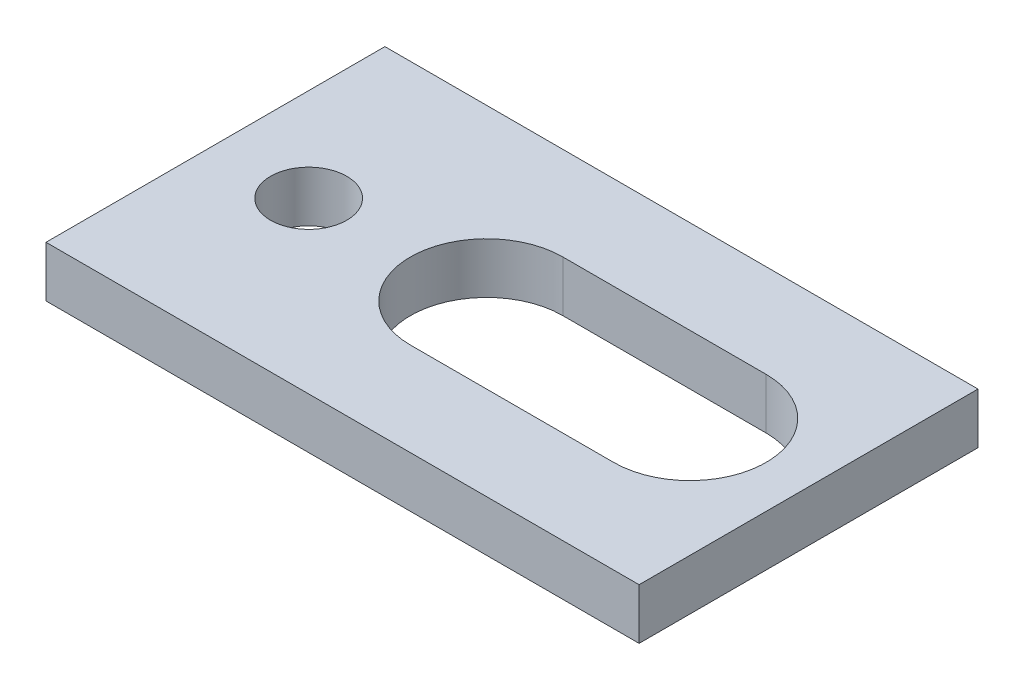
ISO-10303-21;
HEADER;
FILE_DESCRIPTION(('STEP AP214'),'2;1');
FILE_NAME('part.step','',(''),(''),'','','');
FILE_SCHEMA(('AUTOMOTIVE_DESIGN { 1 0 10303 214 1 1 1 1 }'));
ENDSEC;
DATA;
#1=APPLICATION_CONTEXT('core data for automotive mechanical design processes');
#2=APPLICATION_PROTOCOL_DEFINITION('international standard','automotive_design',2000,#1);
#3=PRODUCT_CONTEXT('',#1,'mechanical');
#4=PRODUCT('Part','Part','',(#3));
#5=PRODUCT_RELATED_PRODUCT_CATEGORY('part','',(#4));
#6=PRODUCT_DEFINITION_FORMATION('','',#4);
#7=PRODUCT_DEFINITION_CONTEXT('part definition',#1,'design');
#8=PRODUCT_DEFINITION('design','',#6,#7);
#9=PRODUCT_DEFINITION_SHAPE('','',#8);
#10=(LENGTH_UNIT() NAMED_UNIT(*) SI_UNIT(.MILLI.,.METRE.));
#11=(NAMED_UNIT(*) PLANE_ANGLE_UNIT() SI_UNIT($,.RADIAN.));
#12=(NAMED_UNIT(*) SI_UNIT($,.STERADIAN.) SOLID_ANGLE_UNIT());
#13=UNCERTAINTY_MEASURE_WITH_UNIT(LENGTH_MEASURE(1.E-05),#10,'distance_accuracy_value','');
#14=(GEOMETRIC_REPRESENTATION_CONTEXT(3) GLOBAL_UNCERTAINTY_ASSIGNED_CONTEXT((#13)) GLOBAL_UNIT_ASSIGNED_CONTEXT((#10,
#11,#12)) REPRESENTATION_CONTEXT('',''));
#15=CARTESIAN_POINT('',(0.,0.,0.));
#16=DIRECTION('',(0.,0.,1.));
#17=DIRECTION('',(1.,0.,0.));
#18=AXIS2_PLACEMENT_3D('',#15,#16,#17);
#19=CARTESIAN_POINT('',(-24.9597315436242,3.,-4.13590604026846));
#20=DIRECTION('',(1.,0.,0.));
#21=DIRECTION('',(0.,0.,-1.));
#22=AXIS2_PLACEMENT_3D('',#19,#20,#21);
#23=PLANE('',#22);
#24=DIRECTION('',(0.,0.,1.));
#25=VECTOR('',#24,1.);
#26=CARTESIAN_POINT('',(-24.9597315436242,0.,-4.13590604026846));
#27=LINE('',#26,#25);
#28=CARTESIAN_POINT('',(-24.9597315436242,0.,-4.13590604026846));
#29=VERTEX_POINT('',#28);
#30=CARTESIAN_POINT('',(-24.9597315436242,0.,15.8640939597315));
#31=VERTEX_POINT('',#30);
#32=EDGE_CURVE('E203',#29,#31,#27,.T.);
#33=ORIENTED_EDGE('',*,*,#32,.T.);
#34=DIRECTION('',(0.,-1.,0.));
#35=VECTOR('',#34,1.);
#36=CARTESIAN_POINT('',(-24.9597315436242,3.,15.8640939597315));
#37=LINE('',#36,#35);
#38=CARTESIAN_POINT('',(-24.9597315436242,3.,15.8640939597315));
#39=VERTEX_POINT('',#38);
#40=EDGE_CURVE('E13',#39,#31,#37,.T.);
#41=ORIENTED_EDGE('',*,*,#40,.F.);
#42=DIRECTION('',(0.,0.,1.));
#43=VECTOR('',#42,1.);
#44=CARTESIAN_POINT('',(-24.9597315436242,3.,-4.13590604026846));
#45=LINE('',#44,#43);
#46=CARTESIAN_POINT('',(-24.9597315436242,3.,-4.13590604026846));
#47=VERTEX_POINT('',#46);
#48=EDGE_CURVE('E204',#47,#39,#45,.T.);
#49=ORIENTED_EDGE('',*,*,#48,.F.);
#50=DIRECTION('',(0.,-1.,0.));
#51=VECTOR('',#50,1.);
#52=CARTESIAN_POINT('',(-24.9597315436242,3.,-4.13590604026846));
#53=LINE('',#52,#51);
#54=EDGE_CURVE('E214',#47,#29,#53,.T.);
#55=ORIENTED_EDGE('',*,*,#54,.T.);
#56=EDGE_LOOP('',(#33,#41,#49,#55));
#57=FACE_BOUND('',#56,.T.);
#58=ADVANCED_FACE('F107',(#57),#23,.F.);
#59=CARTESIAN_POINT('',(-24.9597315436242,3.,15.8640939597315));
#60=DIRECTION('',(0.,0.,-1.));
#61=DIRECTION('',(-1.,0.,0.));
#62=AXIS2_PLACEMENT_3D('',#59,#60,#61);
#63=PLANE('',#62);
#64=DIRECTION('',(1.,0.,0.));
#65=VECTOR('',#64,1.);
#66=CARTESIAN_POINT('',(-24.9597315436242,0.,15.8640939597315));
#67=LINE('',#66,#65);
#68=CARTESIAN_POINT('',(10.0402684563758,0.,15.8640939597315));
#69=VERTEX_POINT('',#68);
#70=EDGE_CURVE('E217',#31,#69,#67,.T.);
#71=ORIENTED_EDGE('',*,*,#70,.T.);
#72=DIRECTION('',(0.,-1.,0.));
#73=VECTOR('',#72,1.);
#74=CARTESIAN_POINT('',(10.0402684563758,3.,15.8640939597315));
#75=LINE('',#74,#73);
#76=CARTESIAN_POINT('',(10.0402684563758,3.,15.8640939597315));
#77=VERTEX_POINT('',#76);
#78=EDGE_CURVE('E114',#77,#69,#75,.T.);
#79=ORIENTED_EDGE('',*,*,#78,.F.);
#80=DIRECTION('',(1.,0.,0.));
#81=VECTOR('',#80,1.);
#82=CARTESIAN_POINT('',(-24.9597315436242,3.,15.8640939597315));
#83=LINE('',#82,#81);
#84=EDGE_CURVE('E207',#39,#77,#83,.T.);
#85=ORIENTED_EDGE('',*,*,#84,.F.);
#86=ORIENTED_EDGE('',*,*,#40,.T.);
#87=EDGE_LOOP('',(#71,#79,#85,#86));
#88=FACE_BOUND('',#87,.T.);
#89=ADVANCED_FACE('F245',(#88),#63,.F.);
#90=CARTESIAN_POINT('',(10.0402684563758,3.,-4.13590604026846));
#91=DIRECTION('',(-1.,0.,0.));
#92=DIRECTION('',(0.,0.,1.));
#93=AXIS2_PLACEMENT_3D('',#90,#91,#92);
#94=PLANE('',#93);
#95=DIRECTION('',(0.,0.,-1.));
#96=VECTOR('',#95,1.);
#97=CARTESIAN_POINT('',(10.0402684563758,0.,-4.13590604026846));
#98=LINE('',#97,#96);
#99=CARTESIAN_POINT('',(10.0402684563758,0.,-4.13590604026846));
#100=VERTEX_POINT('',#99);
#101=EDGE_CURVE('E219',#69,#100,#98,.T.);
#102=ORIENTED_EDGE('',*,*,#101,.T.);
#103=DIRECTION('',(0.,-1.,0.));
#104=VECTOR('',#103,1.);
#105=CARTESIAN_POINT('',(10.0402684563758,3.,-4.13590604026846));
#106=LINE('',#105,#104);
#107=CARTESIAN_POINT('',(10.0402684563758,3.,-4.13590604026846));
#108=VERTEX_POINT('',#107);
#109=EDGE_CURVE('E224',#108,#100,#106,.T.);
#110=ORIENTED_EDGE('',*,*,#109,.F.);
#111=DIRECTION('',(0.,0.,-1.));
#112=VECTOR('',#111,1.);
#113=CARTESIAN_POINT('',(10.0402684563758,3.,-4.13590604026846));
#114=LINE('',#113,#112);
#115=EDGE_CURVE('E210',#77,#108,#114,.T.);
#116=ORIENTED_EDGE('',*,*,#115,.F.);
#117=ORIENTED_EDGE('',*,*,#78,.T.);
#118=EDGE_LOOP('',(#102,#110,#116,#117));
#119=FACE_BOUND('',#118,.T.);
#120=ADVANCED_FACE('F231',(#119),#94,.F.);
#121=CARTESIAN_POINT('',(-24.9597315436242,3.,-4.13590604026846));
#122=DIRECTION('',(0.,0.,1.));
#123=DIRECTION('',(1.,0.,0.));
#124=AXIS2_PLACEMENT_3D('',#121,#122,#123);
#125=PLANE('',#124);
#126=DIRECTION('',(-1.,0.,0.));
#127=VECTOR('',#126,1.);
#128=CARTESIAN_POINT('',(-24.9597315436242,0.,-4.13590604026846));
#129=LINE('',#128,#127);
#130=EDGE_CURVE('E208',#100,#29,#129,.T.);
#131=ORIENTED_EDGE('',*,*,#130,.T.);
#132=ORIENTED_EDGE('',*,*,#54,.F.);
#133=DIRECTION('',(-1.,0.,0.));
#134=VECTOR('',#133,1.);
#135=CARTESIAN_POINT('',(-24.9597315436242,3.,-4.13590604026846));
#136=LINE('',#135,#134);
#137=EDGE_CURVE('E212',#108,#47,#136,.T.);
#138=ORIENTED_EDGE('',*,*,#137,.F.);
#139=ORIENTED_EDGE('',*,*,#109,.T.);
#140=EDGE_LOOP('',(#131,#132,#138,#139));
#141=FACE_BOUND('',#140,.T.);
#142=ADVANCED_FACE('F238',(#141),#125,.F.);
#143=CARTESIAN_POINT('',(0.,3.,0.));
#144=DIRECTION('',(0.,1.,0.));
#145=DIRECTION('',(0.,0.,1.));
#146=AXIS2_PLACEMENT_3D('',#143,#144,#145);
#147=PLANE('',#146);
#148=CARTESIAN_POINT('',(-19.4597315436242,3.,5.86409395973154));
#149=DIRECTION('',(0.,1.,0.));
#150=DIRECTION('',(0.,0.,1.));
#151=AXIS2_PLACEMENT_3D('',#148,#149,#150);
#152=CIRCLE('',#151,2.25);
#153=CARTESIAN_POINT('',(-19.4597315436242,3.,8.11409395973154));
#154=VERTEX_POINT('',#153);
#155=EDGE_CURVE('E284',#154,#154,#152,.T.);
#156=ORIENTED_EDGE('',*,*,#155,.F.);
#157=EDGE_LOOP('',(#156));
#158=FACE_BOUND('',#157,.T.);
#159=DIRECTION('',(1.,0.,0.));
#160=VECTOR('',#159,1.);
#161=CARTESIAN_POINT('',(-8.95973154362416,3.,10.3640939597316));
#162=LINE('',#161,#160);
#163=CARTESIAN_POINT('',(-8.95973154362416,3.,10.3640939597315));
#164=VERTEX_POINT('',#163);
#165=CARTESIAN_POINT('',(3.04026845637584,3.,10.3640939597316));
#166=VERTEX_POINT('',#165);
#167=EDGE_CURVE('E179',#164,#166,#162,.T.);
#168=ORIENTED_EDGE('',*,*,#167,.F.);
#169=CARTESIAN_POINT('',(-8.95973154362416,3.,5.86409395973154));
#170=DIRECTION('',(0.,1.,0.));
#171=DIRECTION('',(0.,0.,1.));
#172=AXIS2_PLACEMENT_3D('',#169,#170,#171);
#173=CIRCLE('',#172,4.5);
#174=CARTESIAN_POINT('',(-8.95973154362416,3.,1.36409395973154));
#175=VERTEX_POINT('',#174);
#176=EDGE_CURVE('E183',#175,#164,#173,.T.);
#177=ORIENTED_EDGE('',*,*,#176,.F.);
#178=DIRECTION('',(1.,0.,0.));
#179=VECTOR('',#178,1.);
#180=CARTESIAN_POINT('',(-8.95973154362416,3.,1.36409395973154));
#181=LINE('',#180,#179);
#182=CARTESIAN_POINT('',(3.04026845637584,3.,1.36409395973154));
#183=VERTEX_POINT('',#182);
#184=EDGE_CURVE('E190',#175,#183,#181,.T.);
#185=ORIENTED_EDGE('',*,*,#184,.T.);
#186=CARTESIAN_POINT('',(3.04026845637584,3.,5.86409395973154));
#187=DIRECTION('',(0.,1.,0.));
#188=DIRECTION('',(0.,0.,1.));
#189=AXIS2_PLACEMENT_3D('',#186,#187,#188);
#190=CIRCLE('',#189,4.5);
#191=EDGE_CURVE('E195',#166,#183,#190,.T.);
#192=ORIENTED_EDGE('',*,*,#191,.F.);
#193=EDGE_LOOP('',(#168,#177,#185,#192));
#194=FACE_BOUND('',#193,.T.);
#195=ORIENTED_EDGE('',*,*,#48,.T.);
#196=ORIENTED_EDGE('',*,*,#84,.T.);
#197=ORIENTED_EDGE('',*,*,#115,.T.);
#198=ORIENTED_EDGE('',*,*,#137,.T.);
#199=EDGE_LOOP('',(#195,#196,#197,#198));
#200=FACE_BOUND('',#199,.T.);
#201=ADVANCED_FACE('F244',(#158,#194,#200),#147,.T.);
#202=CARTESIAN_POINT('',(0.,0.,0.));
#203=DIRECTION('',(0.,1.,0.));
#204=DIRECTION('',(0.,0.,1.));
#205=AXIS2_PLACEMENT_3D('',#202,#203,#204);
#206=PLANE('',#205);
#207=CARTESIAN_POINT('',(-19.4597315436242,0.,5.86409395973154));
#208=DIRECTION('',(0.,1.,0.));
#209=DIRECTION('',(0.,0.,1.));
#210=AXIS2_PLACEMENT_3D('',#207,#208,#209);
#211=CIRCLE('',#210,2.25);
#212=CARTESIAN_POINT('',(-19.4597315436242,0.,8.11409395973154));
#213=VERTEX_POINT('',#212);
#214=EDGE_CURVE('E281',#213,#213,#211,.T.);
#215=ORIENTED_EDGE('',*,*,#214,.T.);
#216=EDGE_LOOP('',(#215));
#217=FACE_BOUND('',#216,.T.);
#218=DIRECTION('',(1.,0.,0.));
#219=VECTOR('',#218,1.);
#220=CARTESIAN_POINT('',(-8.95973154362416,0.,10.3640939597315));
#221=LINE('',#220,#219);
#222=CARTESIAN_POINT('',(-8.95973154362416,0.,10.3640939597315));
#223=VERTEX_POINT('',#222);
#224=CARTESIAN_POINT('',(3.04026845637584,0.,10.3640939597315));
#225=VERTEX_POINT('',#224);
#226=EDGE_CURVE('E171',#223,#225,#221,.T.);
#227=ORIENTED_EDGE('',*,*,#226,.T.);
#228=CARTESIAN_POINT('',(3.04026845637584,0.,5.86409395973154));
#229=DIRECTION('',(0.,1.,0.));
#230=DIRECTION('',(0.,0.,1.));
#231=AXIS2_PLACEMENT_3D('',#228,#229,#230);
#232=CIRCLE('',#231,4.5);
#233=CARTESIAN_POINT('',(3.04026845637584,0.,1.36409395973154));
#234=VERTEX_POINT('',#233);
#235=EDGE_CURVE('E198',#225,#234,#232,.T.);
#236=ORIENTED_EDGE('',*,*,#235,.T.);
#237=DIRECTION('',(1.,0.,0.));
#238=VECTOR('',#237,1.);
#239=CARTESIAN_POINT('',(-8.95973154362416,0.,1.36409395973154));
#240=LINE('',#239,#238);
#241=CARTESIAN_POINT('',(-8.95973154362416,0.,1.36409395973154));
#242=VERTEX_POINT('',#241);
#243=EDGE_CURVE('E178',#242,#234,#240,.T.);
#244=ORIENTED_EDGE('',*,*,#243,.F.);
#245=CARTESIAN_POINT('',(-8.95973154362416,0.,5.86409395973154));
#246=DIRECTION('',(0.,1.,0.));
#247=DIRECTION('',(0.,0.,1.));
#248=AXIS2_PLACEMENT_3D('',#245,#246,#247);
#249=CIRCLE('',#248,4.5);
#250=EDGE_CURVE('E126',#242,#223,#249,.T.);
#251=ORIENTED_EDGE('',*,*,#250,.T.);
#252=EDGE_LOOP('',(#227,#236,#244,#251));
#253=FACE_BOUND('',#252,.T.);
#254=ORIENTED_EDGE('',*,*,#32,.F.);
#255=ORIENTED_EDGE('',*,*,#130,.F.);
#256=ORIENTED_EDGE('',*,*,#101,.F.);
#257=ORIENTED_EDGE('',*,*,#70,.F.);
#258=EDGE_LOOP('',(#254,#255,#256,#257));
#259=FACE_BOUND('',#258,.T.);
#260=ADVANCED_FACE('F187',(#217,#253,#259),#206,.F.);
#261=CARTESIAN_POINT('',(3.04026845637584,3.,5.86409395973154));
#262=DIRECTION('',(0.,1.,0.));
#263=DIRECTION('',(0.,0.,1.));
#264=AXIS2_PLACEMENT_3D('',#261,#262,#263);
#265=CYLINDRICAL_SURFACE('',#264,4.5);
#266=ORIENTED_EDGE('',*,*,#235,.F.);
#267=DIRECTION('',(0.,1.,0.));
#268=VECTOR('',#267,1.);
#269=CARTESIAN_POINT('',(3.04026845637584,3.,10.3640939597315));
#270=LINE('',#269,#268);
#271=EDGE_CURVE('E175',#166,#225,#270,.F.);
#272=ORIENTED_EDGE('',*,*,#271,.F.);
#273=ORIENTED_EDGE('',*,*,#191,.T.);
#274=DIRECTION('',(0.,1.,0.));
#275=VECTOR('',#274,1.);
#276=CARTESIAN_POINT('',(3.04026845637584,3.,1.36409395973154));
#277=LINE('',#276,#275);
#278=EDGE_CURVE('E200',#234,#183,#277,.T.);
#279=ORIENTED_EDGE('',*,*,#278,.F.);
#280=EDGE_LOOP('',(#266,#272,#273,#279));
#281=FACE_BOUND('',#280,.T.);
#282=ADVANCED_FACE('F257',(#281),#265,.F.);
#283=CARTESIAN_POINT('',(-8.95973154362416,3.,5.86409395973154));
#284=DIRECTION('',(0.,1.,0.));
#285=DIRECTION('',(0.,0.,1.));
#286=AXIS2_PLACEMENT_3D('',#283,#284,#285);
#287=CYLINDRICAL_SURFACE('',#286,4.5);
#288=ORIENTED_EDGE('',*,*,#176,.T.);
#289=DIRECTION('',(0.,1.,0.));
#290=VECTOR('',#289,1.);
#291=CARTESIAN_POINT('',(-8.95973154362416,3.,10.3640939597315));
#292=LINE('',#291,#290);
#293=EDGE_CURVE('E173',#223,#164,#292,.T.);
#294=ORIENTED_EDGE('',*,*,#293,.F.);
#295=ORIENTED_EDGE('',*,*,#250,.F.);
#296=DIRECTION('',(0.,1.,0.));
#297=VECTOR('',#296,1.);
#298=CARTESIAN_POINT('',(-8.95973154362416,3.,1.36409395973154));
#299=LINE('',#298,#297);
#300=EDGE_CURVE('E121',#175,#242,#299,.F.);
#301=ORIENTED_EDGE('',*,*,#300,.F.);
#302=EDGE_LOOP('',(#288,#294,#295,#301));
#303=FACE_BOUND('',#302,.T.);
#304=ADVANCED_FACE('F181',(#303),#287,.F.);
#305=CARTESIAN_POINT('',(-8.95973154362416,3.,1.36409395973154));
#306=DIRECTION('',(0.,0.,-1.));
#307=DIRECTION('',(-1.,0.,0.));
#308=AXIS2_PLACEMENT_3D('',#305,#306,#307);
#309=PLANE('',#308);
#310=ORIENTED_EDGE('',*,*,#278,.T.);
#311=ORIENTED_EDGE('',*,*,#184,.F.);
#312=ORIENTED_EDGE('',*,*,#300,.T.);
#313=ORIENTED_EDGE('',*,*,#243,.T.);
#314=EDGE_LOOP('',(#310,#311,#312,#313));
#315=FACE_BOUND('',#314,.T.);
#316=ADVANCED_FACE('F267',(#315),#309,.F.);
#317=CARTESIAN_POINT('',(-8.95973154362416,3.,10.3640939597315));
#318=DIRECTION('',(0.,0.,1.));
#319=DIRECTION('',(1.,0.,0.));
#320=AXIS2_PLACEMENT_3D('',#317,#318,#319);
#321=PLANE('',#320);
#322=ORIENTED_EDGE('',*,*,#271,.T.);
#323=ORIENTED_EDGE('',*,*,#226,.F.);
#324=ORIENTED_EDGE('',*,*,#293,.T.);
#325=ORIENTED_EDGE('',*,*,#167,.T.);
#326=EDGE_LOOP('',(#322,#323,#324,#325));
#327=FACE_BOUND('',#326,.T.);
#328=ADVANCED_FACE('F172',(#327),#321,.F.);
#329=CARTESIAN_POINT('',(-19.4597315436242,3.,5.86409395973154));
#330=DIRECTION('',(0.,1.,0.));
#331=DIRECTION('',(0.,0.,1.));
#332=AXIS2_PLACEMENT_3D('',#329,#330,#331);
#333=CYLINDRICAL_SURFACE('',#332,2.25);
#334=ORIENTED_EDGE('',*,*,#214,.F.);
#335=EDGE_LOOP('',(#334));
#336=FACE_BOUND('',#335,.T.);
#337=ORIENTED_EDGE('',*,*,#155,.T.);
#338=EDGE_LOOP('',(#337));
#339=FACE_BOUND('',#338,.T.);
#340=ADVANCED_FACE('F273',(#336,#339),#333,.F.);
#341=CLOSED_SHELL('',(#58,#89,#120,#142,#201,#260,#282,#304,#316,#328,#340));
#342=MANIFOLD_SOLID_BREP('B2',#341);
#343=ADVANCED_BREP_SHAPE_REPRESENTATION('',(#18,#342),#14);
#344=SHAPE_DEFINITION_REPRESENTATION(#9,#343);
ENDSEC;
END-ISO-10303-21;
